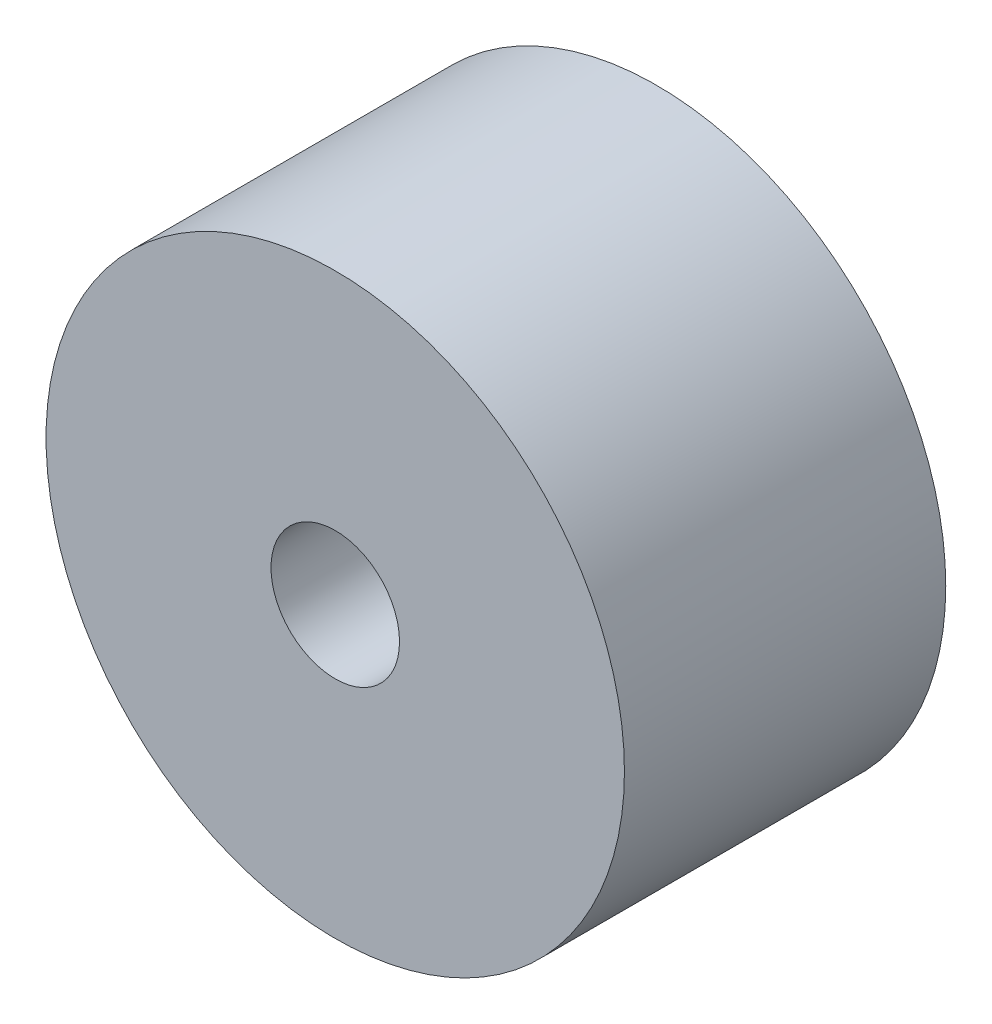
ISO-10303-21;
HEADER;
FILE_DESCRIPTION(('STEP AP214'),'2;1');
FILE_NAME('part.step','',(''),(''),'','','');
FILE_SCHEMA(('AUTOMOTIVE_DESIGN { 1 0 10303 214 1 1 1 1 }'));
ENDSEC;
DATA;
#1=APPLICATION_CONTEXT('core data for automotive mechanical design processes');
#2=APPLICATION_PROTOCOL_DEFINITION('international standard','automotive_design',2000,#1);
#3=PRODUCT_CONTEXT('',#1,'mechanical');
#4=PRODUCT('Part','Part','',(#3));
#5=PRODUCT_RELATED_PRODUCT_CATEGORY('part','',(#4));
#6=PRODUCT_DEFINITION_FORMATION('','',#4);
#7=PRODUCT_DEFINITION_CONTEXT('part definition',#1,'design');
#8=PRODUCT_DEFINITION('design','',#6,#7);
#9=PRODUCT_DEFINITION_SHAPE('','',#8);
#10=(LENGTH_UNIT() NAMED_UNIT(*) SI_UNIT(.MILLI.,.METRE.));
#11=(NAMED_UNIT(*) PLANE_ANGLE_UNIT() SI_UNIT($,.RADIAN.));
#12=(NAMED_UNIT(*) SI_UNIT($,.STERADIAN.) SOLID_ANGLE_UNIT());
#13=UNCERTAINTY_MEASURE_WITH_UNIT(LENGTH_MEASURE(1.E-05),#10,'distance_accuracy_value','');
#14=(GEOMETRIC_REPRESENTATION_CONTEXT(3) GLOBAL_UNCERTAINTY_ASSIGNED_CONTEXT((#13)) GLOBAL_UNIT_ASSIGNED_CONTEXT((#10,
#11,#12)) REPRESENTATION_CONTEXT('',''));
#15=CARTESIAN_POINT('',(0.,0.,0.));
#16=DIRECTION('',(0.,0.,1.));
#17=DIRECTION('',(1.,0.,0.));
#18=AXIS2_PLACEMENT_3D('',#15,#16,#17);
#19=CARTESIAN_POINT('',(0.,0.,20.));
#20=DIRECTION('',(0.,0.,-1.));
#21=DIRECTION('',(-1.,0.,0.));
#22=AXIS2_PLACEMENT_3D('',#19,#20,#21);
#23=CYLINDRICAL_SURFACE('',#22,18.);
#24=CARTESIAN_POINT('',(0.,0.,20.));
#25=DIRECTION('',(0.,0.,1.));
#26=DIRECTION('',(1.,0.,0.));
#27=AXIS2_PLACEMENT_3D('',#24,#25,#26);
#28=CIRCLE('',#27,18.);
#29=CARTESIAN_POINT('',(18.,0.,20.));
#30=VERTEX_POINT('',#29);
#31=EDGE_CURVE('E10',#30,#30,#28,.T.);
#32=ORIENTED_EDGE('',*,*,#31,.F.);
#33=EDGE_LOOP('',(#32));
#34=FACE_BOUND('',#33,.T.);
#35=CARTESIAN_POINT('',(0.,0.,0.));
#36=DIRECTION('',(0.,0.,1.));
#37=DIRECTION('',(1.,0.,0.));
#38=AXIS2_PLACEMENT_3D('',#35,#36,#37);
#39=CIRCLE('',#38,18.);
#40=CARTESIAN_POINT('',(18.,0.,0.));
#41=VERTEX_POINT('',#40);
#42=EDGE_CURVE('E37',#41,#41,#39,.T.);
#43=ORIENTED_EDGE('',*,*,#42,.T.);
#44=EDGE_LOOP('',(#43));
#45=FACE_BOUND('',#44,.T.);
#46=ADVANCED_FACE('F40',(#34,#45),#23,.T.);
#47=CARTESIAN_POINT('',(0.,0.,20.));
#48=DIRECTION('',(0.,0.,1.));
#49=DIRECTION('',(1.,0.,0.));
#50=AXIS2_PLACEMENT_3D('',#47,#48,#49);
#51=PLANE('',#50);
#52=CARTESIAN_POINT('',(0.,0.,20.));
#53=DIRECTION('',(0.,0.,1.));
#54=DIRECTION('',(1.,0.,0.));
#55=AXIS2_PLACEMENT_3D('',#52,#53,#54);
#56=CIRCLE('',#55,4.);
#57=CARTESIAN_POINT('',(4.,0.,20.));
#58=VERTEX_POINT('',#57);
#59=EDGE_CURVE('E50',#58,#58,#56,.T.);
#60=ORIENTED_EDGE('',*,*,#59,.F.);
#61=EDGE_LOOP('',(#60));
#62=FACE_BOUND('',#61,.T.);
#63=ORIENTED_EDGE('',*,*,#31,.T.);
#64=EDGE_LOOP('',(#63));
#65=FACE_BOUND('',#64,.T.);
#66=ADVANCED_FACE('F59',(#62,#65),#51,.T.);
#67=CARTESIAN_POINT('',(0.,0.,0.));
#68=DIRECTION('',(0.,0.,1.));
#69=DIRECTION('',(1.,0.,0.));
#70=AXIS2_PLACEMENT_3D('',#67,#68,#69);
#71=PLANE('',#70);
#72=CARTESIAN_POINT('',(0.,0.,0.));
#73=DIRECTION('',(0.,0.,1.));
#74=DIRECTION('',(1.,0.,0.));
#75=AXIS2_PLACEMENT_3D('',#72,#73,#74);
#76=CIRCLE('',#75,4.);
#77=CARTESIAN_POINT('',(4.,0.,0.));
#78=VERTEX_POINT('',#77);
#79=EDGE_CURVE('E47',#78,#78,#76,.T.);
#80=ORIENTED_EDGE('',*,*,#79,.T.);
#81=EDGE_LOOP('',(#80));
#82=FACE_BOUND('',#81,.T.);
#83=ORIENTED_EDGE('',*,*,#42,.F.);
#84=EDGE_LOOP('',(#83));
#85=FACE_BOUND('',#84,.T.);
#86=ADVANCED_FACE('F58',(#82,#85),#71,.F.);
#87=CARTESIAN_POINT('',(0.,0.,20.));
#88=DIRECTION('',(0.,0.,-1.));
#89=DIRECTION('',(-1.,0.,0.));
#90=AXIS2_PLACEMENT_3D('',#87,#88,#89);
#91=CYLINDRICAL_SURFACE('',#90,4.);
#92=ORIENTED_EDGE('',*,*,#59,.T.);
#93=EDGE_LOOP('',(#92));
#94=FACE_BOUND('',#93,.T.);
#95=ORIENTED_EDGE('',*,*,#79,.F.);
#96=EDGE_LOOP('',(#95));
#97=FACE_BOUND('',#96,.T.);
#98=ADVANCED_FACE('F54',(#94,#97),#91,.F.);
#99=CLOSED_SHELL('',(#46,#66,#86,#98));
#100=MANIFOLD_SOLID_BREP('B2',#99);
#101=ADVANCED_BREP_SHAPE_REPRESENTATION('',(#18,#100),#14);
#102=SHAPE_DEFINITION_REPRESENTATION(#9,#101);
ENDSEC;
END-ISO-10303-21;
